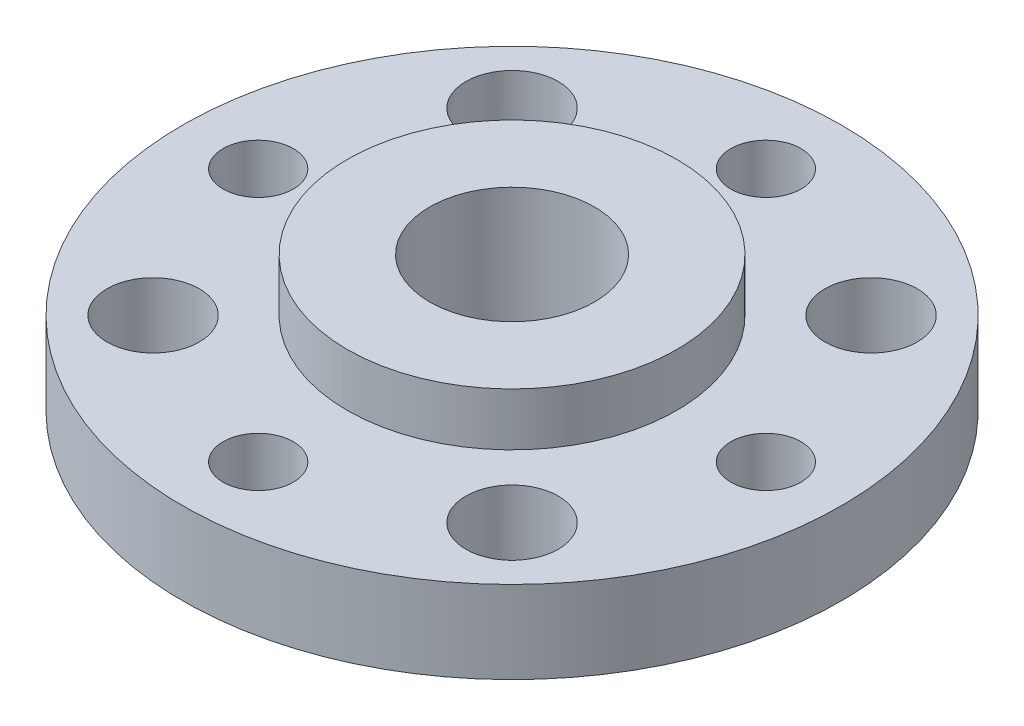
ISO-10303-21;
HEADER;
FILE_DESCRIPTION(('STEP AP214'),'2;1');
FILE_NAME('part.step','',(''),(''),'','','');
FILE_SCHEMA(('AUTOMOTIVE_DESIGN { 1 0 10303 214 1 1 1 1 }'));
ENDSEC;
DATA;
#1=APPLICATION_CONTEXT('core data for automotive mechanical design processes');
#2=APPLICATION_PROTOCOL_DEFINITION('international standard','automotive_design',2000,#1);
#3=PRODUCT_CONTEXT('',#1,'mechanical');
#4=PRODUCT('Part','Part','',(#3));
#5=PRODUCT_RELATED_PRODUCT_CATEGORY('part','',(#4));
#6=PRODUCT_DEFINITION_FORMATION('','',#4);
#7=PRODUCT_DEFINITION_CONTEXT('part definition',#1,'design');
#8=PRODUCT_DEFINITION('design','',#6,#7);
#9=PRODUCT_DEFINITION_SHAPE('','',#8);
#10=(LENGTH_UNIT() NAMED_UNIT(*) SI_UNIT(.MILLI.,.METRE.));
#11=(NAMED_UNIT(*) PLANE_ANGLE_UNIT() SI_UNIT($,.RADIAN.));
#12=(NAMED_UNIT(*) SI_UNIT($,.STERADIAN.) SOLID_ANGLE_UNIT());
#13=UNCERTAINTY_MEASURE_WITH_UNIT(LENGTH_MEASURE(1.E-05),#10,'distance_accuracy_value','');
#14=(GEOMETRIC_REPRESENTATION_CONTEXT(3) GLOBAL_UNCERTAINTY_ASSIGNED_CONTEXT((#13)) GLOBAL_UNIT_ASSIGNED_CONTEXT((#10,
#11,#12)) REPRESENTATION_CONTEXT('',''));
#15=CARTESIAN_POINT('',(0.,0.,0.));
#16=DIRECTION('',(0.,0.,1.));
#17=DIRECTION('',(1.,0.,0.));
#18=AXIS2_PLACEMENT_3D('',#15,#16,#17);
#19=CARTESIAN_POINT('',(0.,3.175,0.));
#20=DIRECTION('',(0.,-1.,0.));
#21=DIRECTION('',(0.,0.,-1.));
#22=AXIS2_PLACEMENT_3D('',#19,#20,#21);
#23=CYLINDRICAL_SURFACE('',#22,12.69619);
#24=CARTESIAN_POINT('',(0.,3.175,0.));
#25=DIRECTION('',(0.,-1.,0.));
#26=DIRECTION('',(0.,0.,-1.));
#27=AXIS2_PLACEMENT_3D('',#24,#25,#26);
#28=CIRCLE('',#27,12.69619);
#29=CARTESIAN_POINT('',(0.,3.175,-12.69619));
#30=VERTEX_POINT('',#29);
#31=EDGE_CURVE('E10',#30,#30,#28,.T.);
#32=ORIENTED_EDGE('',*,*,#31,.T.);
#33=EDGE_LOOP('',(#32));
#34=FACE_BOUND('',#33,.T.);
#35=CARTESIAN_POINT('',(0.,0.,0.));
#36=DIRECTION('',(0.,-1.,0.));
#37=DIRECTION('',(0.,0.,-1.));
#38=AXIS2_PLACEMENT_3D('',#35,#36,#37);
#39=CIRCLE('',#38,12.69619);
#40=CARTESIAN_POINT('',(0.,0.,-12.69619));
#41=VERTEX_POINT('',#40);
#42=EDGE_CURVE('E37',#41,#41,#39,.T.);
#43=ORIENTED_EDGE('',*,*,#42,.F.);
#44=EDGE_LOOP('',(#43));
#45=FACE_BOUND('',#44,.T.);
#46=ADVANCED_FACE('F31',(#34,#45),#23,.T.);
#47=CARTESIAN_POINT('',(12.69619,3.175,0.));
#48=DIRECTION('',(0.,1.,0.));
#49=DIRECTION('',(0.,0.,1.));
#50=AXIS2_PLACEMENT_3D('',#47,#48,#49);
#51=PLANE('',#50);
#52=CARTESIAN_POINT('',(-6.91479721322333,3.175,-6.91479721322316));
#53=DIRECTION('',(0.,1.,0.));
#54=DIRECTION('',(0.,0.,1.));
#55=AXIS2_PLACEMENT_3D('',#52,#53,#54);
#56=CIRCLE('',#55,1.77799999999998);
#57=CARTESIAN_POINT('',(-6.91479721322333,3.175,-5.13679721322318));
#58=VERTEX_POINT('',#57);
#59=EDGE_CURVE('E92',#58,#58,#56,.T.);
#60=ORIENTED_EDGE('',*,*,#59,.F.);
#61=EDGE_LOOP('',(#60));
#62=FACE_BOUND('',#61,.T.);
#63=CARTESIAN_POINT('',(6.91479721322324,3.175,-6.91479721322326));
#64=DIRECTION('',(0.,1.,0.));
#65=DIRECTION('',(0.,0.,1.));
#66=AXIS2_PLACEMENT_3D('',#63,#64,#65);
#67=CIRCLE('',#66,1.77799999999998);
#68=CARTESIAN_POINT('',(6.91479721322324,3.175,-5.13679721322328));
#69=VERTEX_POINT('',#68);
#70=EDGE_CURVE('E86',#69,#69,#67,.T.);
#71=ORIENTED_EDGE('',*,*,#70,.F.);
#72=EDGE_LOOP('',(#71));
#73=FACE_BOUND('',#72,.T.);
#74=CARTESIAN_POINT('',(6.91479721322328,3.175,6.91479721322321));
#75=DIRECTION('',(0.,1.,0.));
#76=DIRECTION('',(0.,0.,1.));
#77=AXIS2_PLACEMENT_3D('',#74,#75,#76);
#78=CIRCLE('',#77,1.77799999999998);
#79=CARTESIAN_POINT('',(6.91479721322328,3.175,8.69279721322319));
#80=VERTEX_POINT('',#79);
#81=EDGE_CURVE('E80',#80,#80,#78,.T.);
#82=ORIENTED_EDGE('',*,*,#81,.F.);
#83=EDGE_LOOP('',(#82));
#84=FACE_BOUND('',#83,.T.);
#85=CARTESIAN_POINT('',(-6.91479721322324,3.175,6.91479721322326));
#86=DIRECTION('',(0.,1.,0.));
#87=DIRECTION('',(0.,0.,1.));
#88=AXIS2_PLACEMENT_3D('',#85,#86,#87);
#89=CIRCLE('',#88,1.77799999999998);
#90=CARTESIAN_POINT('',(-6.91479721322324,3.175,8.69279721322324));
#91=VERTEX_POINT('',#90);
#92=EDGE_CURVE('E74',#91,#91,#89,.T.);
#93=ORIENTED_EDGE('',*,*,#92,.F.);
#94=EDGE_LOOP('',(#93));
#95=FACE_BOUND('',#94,.T.);
#96=CARTESIAN_POINT('',(-9.779,3.175,1.02429588037641E-13));
#97=DIRECTION('',(0.,1.,0.));
#98=DIRECTION('',(0.,0.,1.));
#99=AXIS2_PLACEMENT_3D('',#96,#97,#98);
#100=CIRCLE('',#99,1.35254999999999);
#101=CARTESIAN_POINT('',(-9.779,3.175,1.35255000000009));
#102=VERTEX_POINT('',#101);
#103=EDGE_CURVE('E71',#102,#102,#100,.T.);
#104=ORIENTED_EDGE('',*,*,#103,.F.);
#105=EDGE_LOOP('',(#104));
#106=FACE_BOUND('',#105,.T.);
#107=CARTESIAN_POINT('',(0.,3.175,-9.779));
#108=DIRECTION('',(0.,1.,0.));
#109=DIRECTION('',(0.,0.,1.));
#110=AXIS2_PLACEMENT_3D('',#107,#108,#109);
#111=CIRCLE('',#110,1.35254999999999);
#112=CARTESIAN_POINT('',(0.,3.175,-8.42645000000001));
#113=VERTEX_POINT('',#112);
#114=EDGE_CURVE('E65',#113,#113,#111,.T.);
#115=ORIENTED_EDGE('',*,*,#114,.F.);
#116=EDGE_LOOP('',(#115));
#117=FACE_BOUND('',#116,.T.);
#118=CARTESIAN_POINT('',(9.779,3.175,0.));
#119=DIRECTION('',(0.,1.,0.));
#120=DIRECTION('',(0.,0.,1.));
#121=AXIS2_PLACEMENT_3D('',#118,#119,#120);
#122=CIRCLE('',#121,1.35254999999999);
#123=CARTESIAN_POINT('',(9.779,3.175,1.35254999999995));
#124=VERTEX_POINT('',#123);
#125=EDGE_CURVE('E59',#124,#124,#122,.T.);
#126=ORIENTED_EDGE('',*,*,#125,.F.);
#127=EDGE_LOOP('',(#126));
#128=FACE_BOUND('',#127,.T.);
#129=CARTESIAN_POINT('',(0.,3.175,9.779));
#130=DIRECTION('',(0.,1.,0.));
#131=DIRECTION('',(0.,0.,1.));
#132=AXIS2_PLACEMENT_3D('',#129,#130,#131);
#133=CIRCLE('',#132,1.35254999999999);
#134=CARTESIAN_POINT('',(0.,3.175,11.13155));
#135=VERTEX_POINT('',#134);
#136=EDGE_CURVE('E53',#135,#135,#133,.T.);
#137=ORIENTED_EDGE('',*,*,#136,.F.);
#138=EDGE_LOOP('',(#137));
#139=FACE_BOUND('',#138,.T.);
#140=CARTESIAN_POINT('',(0.,3.175,0.));
#141=DIRECTION('',(0.,1.,0.));
#142=DIRECTION('',(0.,0.,1.));
#143=AXIS2_PLACEMENT_3D('',#140,#141,#142);
#144=CIRCLE('',#143,6.34619);
#145=CARTESIAN_POINT('',(0.,3.175,6.34619));
#146=VERTEX_POINT('',#145);
#147=EDGE_CURVE('E45',#146,#146,#144,.T.);
#148=ORIENTED_EDGE('',*,*,#147,.F.);
#149=EDGE_LOOP('',(#148));
#150=FACE_BOUND('',#149,.T.);
#151=ORIENTED_EDGE('',*,*,#31,.F.);
#152=EDGE_LOOP('',(#151));
#153=FACE_BOUND('',#152,.T.);
#154=ADVANCED_FACE('F128',(#62,#73,#84,#95,#106,#117,#128,#139,#150,#153),#51,.T.);
#155=CARTESIAN_POINT('',(0.,0.,0.));
#156=DIRECTION('',(0.,-1.,0.));
#157=DIRECTION('',(0.,0.,-1.));
#158=AXIS2_PLACEMENT_3D('',#155,#156,#157);
#159=PLANE('',#158);
#160=CARTESIAN_POINT('',(0.,0.,0.));
#161=DIRECTION('',(0.,1.,0.));
#162=DIRECTION('',(0.,0.,1.));
#163=AXIS2_PLACEMENT_3D('',#160,#161,#162);
#164=CIRCLE('',#163,3.175);
#165=CARTESIAN_POINT('',(0.,0.,3.175));
#166=VERTEX_POINT('',#165);
#167=EDGE_CURVE('E98',#166,#166,#164,.T.);
#168=ORIENTED_EDGE('',*,*,#167,.T.);
#169=EDGE_LOOP('',(#168));
#170=FACE_BOUND('',#169,.T.);
#171=CARTESIAN_POINT('',(-6.91479721322333,0.,-6.91479721322316));
#172=DIRECTION('',(0.,-1.,0.));
#173=DIRECTION('',(0.,0.,-1.));
#174=AXIS2_PLACEMENT_3D('',#171,#172,#173);
#175=CIRCLE('',#174,1.77799999999998);
#176=CARTESIAN_POINT('',(-6.91479721322333,0.,-8.69279721322314));
#177=VERTEX_POINT('',#176);
#178=EDGE_CURVE('E95',#177,#177,#175,.T.);
#179=ORIENTED_EDGE('',*,*,#178,.F.);
#180=EDGE_LOOP('',(#179));
#181=FACE_BOUND('',#180,.T.);
#182=CARTESIAN_POINT('',(6.91479721322324,0.,-6.91479721322326));
#183=DIRECTION('',(0.,-1.,0.));
#184=DIRECTION('',(0.,0.,-1.));
#185=AXIS2_PLACEMENT_3D('',#182,#183,#184);
#186=CIRCLE('',#185,1.77799999999998);
#187=CARTESIAN_POINT('',(6.91479721322324,0.,-8.69279721322324));
#188=VERTEX_POINT('',#187);
#189=EDGE_CURVE('E89',#188,#188,#186,.T.);
#190=ORIENTED_EDGE('',*,*,#189,.F.);
#191=EDGE_LOOP('',(#190));
#192=FACE_BOUND('',#191,.T.);
#193=CARTESIAN_POINT('',(6.91479721322328,0.,6.91479721322321));
#194=DIRECTION('',(0.,-1.,0.));
#195=DIRECTION('',(0.,0.,-1.));
#196=AXIS2_PLACEMENT_3D('',#193,#194,#195);
#197=CIRCLE('',#196,1.77799999999998);
#198=CARTESIAN_POINT('',(6.91479721322328,0.,5.13679721322323));
#199=VERTEX_POINT('',#198);
#200=EDGE_CURVE('E83',#199,#199,#197,.T.);
#201=ORIENTED_EDGE('',*,*,#200,.F.);
#202=EDGE_LOOP('',(#201));
#203=FACE_BOUND('',#202,.T.);
#204=CARTESIAN_POINT('',(-6.91479721322324,0.,6.91479721322326));
#205=DIRECTION('',(0.,-1.,0.));
#206=DIRECTION('',(0.,0.,-1.));
#207=AXIS2_PLACEMENT_3D('',#204,#205,#206);
#208=CIRCLE('',#207,1.77799999999998);
#209=CARTESIAN_POINT('',(-6.91479721322324,0.,5.13679721322328));
#210=VERTEX_POINT('',#209);
#211=EDGE_CURVE('E77',#210,#210,#208,.T.);
#212=ORIENTED_EDGE('',*,*,#211,.F.);
#213=EDGE_LOOP('',(#212));
#214=FACE_BOUND('',#213,.T.);
#215=CARTESIAN_POINT('',(-9.779,0.,1.02429588037641E-13));
#216=DIRECTION('',(0.,1.,0.));
#217=DIRECTION('',(0.,0.,1.));
#218=AXIS2_PLACEMENT_3D('',#215,#216,#217);
#219=CIRCLE('',#218,1.35254999999999);
#220=CARTESIAN_POINT('',(-9.779,0.,1.35255000000009));
#221=VERTEX_POINT('',#220);
#222=EDGE_CURVE('E68',#221,#221,#219,.T.);
#223=ORIENTED_EDGE('',*,*,#222,.T.);
#224=EDGE_LOOP('',(#223));
#225=FACE_BOUND('',#224,.T.);
#226=CARTESIAN_POINT('',(0.,0.,-9.779));
#227=DIRECTION('',(0.,1.,0.));
#228=DIRECTION('',(0.,0.,1.));
#229=AXIS2_PLACEMENT_3D('',#226,#227,#228);
#230=CIRCLE('',#229,1.35254999999999);
#231=CARTESIAN_POINT('',(0.,0.,-8.42645000000001));
#232=VERTEX_POINT('',#231);
#233=EDGE_CURVE('E62',#232,#232,#230,.T.);
#234=ORIENTED_EDGE('',*,*,#233,.T.);
#235=EDGE_LOOP('',(#234));
#236=FACE_BOUND('',#235,.T.);
#237=CARTESIAN_POINT('',(9.779,0.,0.));
#238=DIRECTION('',(0.,1.,0.));
#239=DIRECTION('',(0.,0.,1.));
#240=AXIS2_PLACEMENT_3D('',#237,#238,#239);
#241=CIRCLE('',#240,1.35254999999999);
#242=CARTESIAN_POINT('',(9.779,0.,1.35254999999995));
#243=VERTEX_POINT('',#242);
#244=EDGE_CURVE('E56',#243,#243,#241,.T.);
#245=ORIENTED_EDGE('',*,*,#244,.T.);
#246=EDGE_LOOP('',(#245));
#247=FACE_BOUND('',#246,.T.);
#248=CARTESIAN_POINT('',(0.,0.,9.779));
#249=DIRECTION('',(0.,1.,0.));
#250=DIRECTION('',(0.,0.,1.));
#251=AXIS2_PLACEMENT_3D('',#248,#249,#250);
#252=CIRCLE('',#251,1.35254999999999);
#253=CARTESIAN_POINT('',(0.,0.,11.13155));
#254=VERTEX_POINT('',#253);
#255=EDGE_CURVE('E49',#254,#254,#252,.T.);
#256=ORIENTED_EDGE('',*,*,#255,.T.);
#257=EDGE_LOOP('',(#256));
#258=FACE_BOUND('',#257,.T.);
#259=ORIENTED_EDGE('',*,*,#42,.T.);
#260=EDGE_LOOP('',(#259));
#261=FACE_BOUND('',#260,.T.);
#262=ADVANCED_FACE('F105',(#170,#181,#192,#203,#214,#225,#236,#247,#258,#261),#159,.T.);
#263=CARTESIAN_POINT('',(0.,5.207,0.));
#264=DIRECTION('',(0.,-1.,0.));
#265=DIRECTION('',(0.,0.,-1.));
#266=AXIS2_PLACEMENT_3D('',#263,#264,#265);
#267=CYLINDRICAL_SURFACE('',#266,6.34619);
#268=CARTESIAN_POINT('',(0.,5.207,0.));
#269=DIRECTION('',(0.,1.,0.));
#270=DIRECTION('',(0.,0.,1.));
#271=AXIS2_PLACEMENT_3D('',#268,#269,#270);
#272=CIRCLE('',#271,6.34619);
#273=CARTESIAN_POINT('',(0.,5.207,6.34619));
#274=VERTEX_POINT('',#273);
#275=EDGE_CURVE('E41',#274,#274,#272,.T.);
#276=ORIENTED_EDGE('',*,*,#275,.F.);
#277=EDGE_LOOP('',(#276));
#278=FACE_BOUND('',#277,.T.);
#279=ORIENTED_EDGE('',*,*,#147,.T.);
#280=EDGE_LOOP('',(#279));
#281=FACE_BOUND('',#280,.T.);
#282=ADVANCED_FACE('F119',(#278,#281),#267,.T.);
#283=CARTESIAN_POINT('',(0.,5.207,0.));
#284=DIRECTION('',(0.,1.,0.));
#285=DIRECTION('',(0.,0.,1.));
#286=AXIS2_PLACEMENT_3D('',#283,#284,#285);
#287=PLANE('',#286);
#288=CARTESIAN_POINT('',(0.,5.207,0.));
#289=DIRECTION('',(0.,1.,0.));
#290=DIRECTION('',(0.,0.,1.));
#291=AXIS2_PLACEMENT_3D('',#288,#289,#290);
#292=CIRCLE('',#291,3.175);
#293=CARTESIAN_POINT('',(0.,5.207,3.175));
#294=VERTEX_POINT('',#293);
#295=EDGE_CURVE('E99',#294,#294,#292,.T.);
#296=ORIENTED_EDGE('',*,*,#295,.F.);
#297=EDGE_LOOP('',(#296));
#298=FACE_BOUND('',#297,.T.);
#299=ORIENTED_EDGE('',*,*,#275,.T.);
#300=EDGE_LOOP('',(#299));
#301=FACE_BOUND('',#300,.T.);
#302=ADVANCED_FACE('F115',(#298,#301),#287,.T.);
#303=CARTESIAN_POINT('',(0.,3.175,9.779));
#304=DIRECTION('',(0.,1.,0.));
#305=DIRECTION('',(0.,0.,1.));
#306=AXIS2_PLACEMENT_3D('',#303,#304,#305);
#307=CYLINDRICAL_SURFACE('',#306,1.35254999999999);
#308=ORIENTED_EDGE('',*,*,#255,.F.);
#309=EDGE_LOOP('',(#308));
#310=FACE_BOUND('',#309,.T.);
#311=ORIENTED_EDGE('',*,*,#136,.T.);
#312=EDGE_LOOP('',(#311));
#313=FACE_BOUND('',#312,.T.);
#314=ADVANCED_FACE('F118',(#310,#313),#307,.F.);
#315=CARTESIAN_POINT('',(9.779,3.175,0.));
#316=DIRECTION('',(0.,1.,0.));
#317=DIRECTION('',(0.,0.,1.));
#318=AXIS2_PLACEMENT_3D('',#315,#316,#317);
#319=CYLINDRICAL_SURFACE('',#318,1.35254999999999);
#320=ORIENTED_EDGE('',*,*,#244,.F.);
#321=EDGE_LOOP('',(#320));
#322=FACE_BOUND('',#321,.T.);
#323=ORIENTED_EDGE('',*,*,#125,.T.);
#324=EDGE_LOOP('',(#323));
#325=FACE_BOUND('',#324,.T.);
#326=ADVANCED_FACE('F142',(#322,#325),#319,.F.);
#327=CARTESIAN_POINT('',(0.,3.175,-9.779));
#328=DIRECTION('',(0.,1.,0.));
#329=DIRECTION('',(0.,0.,1.));
#330=AXIS2_PLACEMENT_3D('',#327,#328,#329);
#331=CYLINDRICAL_SURFACE('',#330,1.35254999999999);
#332=ORIENTED_EDGE('',*,*,#233,.F.);
#333=EDGE_LOOP('',(#332));
#334=FACE_BOUND('',#333,.T.);
#335=ORIENTED_EDGE('',*,*,#114,.T.);
#336=EDGE_LOOP('',(#335));
#337=FACE_BOUND('',#336,.T.);
#338=ADVANCED_FACE('F146',(#334,#337),#331,.F.);
#339=CARTESIAN_POINT('',(-9.779,3.175,1.02429588037641E-13));
#340=DIRECTION('',(0.,1.,0.));
#341=DIRECTION('',(0.,0.,1.));
#342=AXIS2_PLACEMENT_3D('',#339,#340,#341);
#343=CYLINDRICAL_SURFACE('',#342,1.35254999999999);
#344=ORIENTED_EDGE('',*,*,#222,.F.);
#345=EDGE_LOOP('',(#344));
#346=FACE_BOUND('',#345,.T.);
#347=ORIENTED_EDGE('',*,*,#103,.T.);
#348=EDGE_LOOP('',(#347));
#349=FACE_BOUND('',#348,.T.);
#350=ADVANCED_FACE('F150',(#346,#349),#343,.F.);
#351=CARTESIAN_POINT('',(-6.91479721322324,0.,6.91479721322326));
#352=DIRECTION('',(0.,-1.,0.));
#353=DIRECTION('',(0.,0.,-1.));
#354=AXIS2_PLACEMENT_3D('',#351,#352,#353);
#355=CYLINDRICAL_SURFACE('',#354,1.77799999999998);
#356=ORIENTED_EDGE('',*,*,#92,.T.);
#357=EDGE_LOOP('',(#356));
#358=FACE_BOUND('',#357,.T.);
#359=ORIENTED_EDGE('',*,*,#211,.T.);
#360=EDGE_LOOP('',(#359));
#361=FACE_BOUND('',#360,.T.);
#362=ADVANCED_FACE('F154',(#358,#361),#355,.F.);
#363=CARTESIAN_POINT('',(6.91479721322328,0.,6.91479721322321));
#364=DIRECTION('',(0.,-1.,0.));
#365=DIRECTION('',(0.,0.,-1.));
#366=AXIS2_PLACEMENT_3D('',#363,#364,#365);
#367=CYLINDRICAL_SURFACE('',#366,1.77799999999998);
#368=ORIENTED_EDGE('',*,*,#81,.T.);
#369=EDGE_LOOP('',(#368));
#370=FACE_BOUND('',#369,.T.);
#371=ORIENTED_EDGE('',*,*,#200,.T.);
#372=EDGE_LOOP('',(#371));
#373=FACE_BOUND('',#372,.T.);
#374=ADVANCED_FACE('F158',(#370,#373),#367,.F.);
#375=CARTESIAN_POINT('',(6.91479721322324,0.,-6.91479721322326));
#376=DIRECTION('',(0.,-1.,0.));
#377=DIRECTION('',(0.,0.,-1.));
#378=AXIS2_PLACEMENT_3D('',#375,#376,#377);
#379=CYLINDRICAL_SURFACE('',#378,1.77799999999998);
#380=ORIENTED_EDGE('',*,*,#70,.T.);
#381=EDGE_LOOP('',(#380));
#382=FACE_BOUND('',#381,.T.);
#383=ORIENTED_EDGE('',*,*,#189,.T.);
#384=EDGE_LOOP('',(#383));
#385=FACE_BOUND('',#384,.T.);
#386=ADVANCED_FACE('F162',(#382,#385),#379,.F.);
#387=CARTESIAN_POINT('',(-6.91479721322333,0.,-6.91479721322316));
#388=DIRECTION('',(0.,-1.,0.));
#389=DIRECTION('',(0.,0.,-1.));
#390=AXIS2_PLACEMENT_3D('',#387,#388,#389);
#391=CYLINDRICAL_SURFACE('',#390,1.77799999999998);
#392=ORIENTED_EDGE('',*,*,#59,.T.);
#393=EDGE_LOOP('',(#392));
#394=FACE_BOUND('',#393,.T.);
#395=ORIENTED_EDGE('',*,*,#178,.T.);
#396=EDGE_LOOP('',(#395));
#397=FACE_BOUND('',#396,.T.);
#398=ADVANCED_FACE('F111',(#394,#397),#391,.F.);
#399=CARTESIAN_POINT('',(0.,0.,0.));
#400=DIRECTION('',(0.,1.,0.));
#401=DIRECTION('',(0.,0.,1.));
#402=AXIS2_PLACEMENT_3D('',#399,#400,#401);
#403=CYLINDRICAL_SURFACE('',#402,3.175);
#404=ORIENTED_EDGE('',*,*,#167,.F.);
#405=EDGE_LOOP('',(#404));
#406=FACE_BOUND('',#405,.T.);
#407=ORIENTED_EDGE('',*,*,#295,.T.);
#408=EDGE_LOOP('',(#407));
#409=FACE_BOUND('',#408,.T.);
#410=ADVANCED_FACE('F108',(#406,#409),#403,.F.);
#411=CLOSED_SHELL('',(#46,#154,#262,#282,#302,#314,#326,#338,#350,#362,#374,#386,#398,#410));
#412=MANIFOLD_SOLID_BREP('B2',#411);
#413=ADVANCED_BREP_SHAPE_REPRESENTATION('',(#18,#412),#14);
#414=SHAPE_DEFINITION_REPRESENTATION(#9,#413);
ENDSEC;
END-ISO-10303-21;
